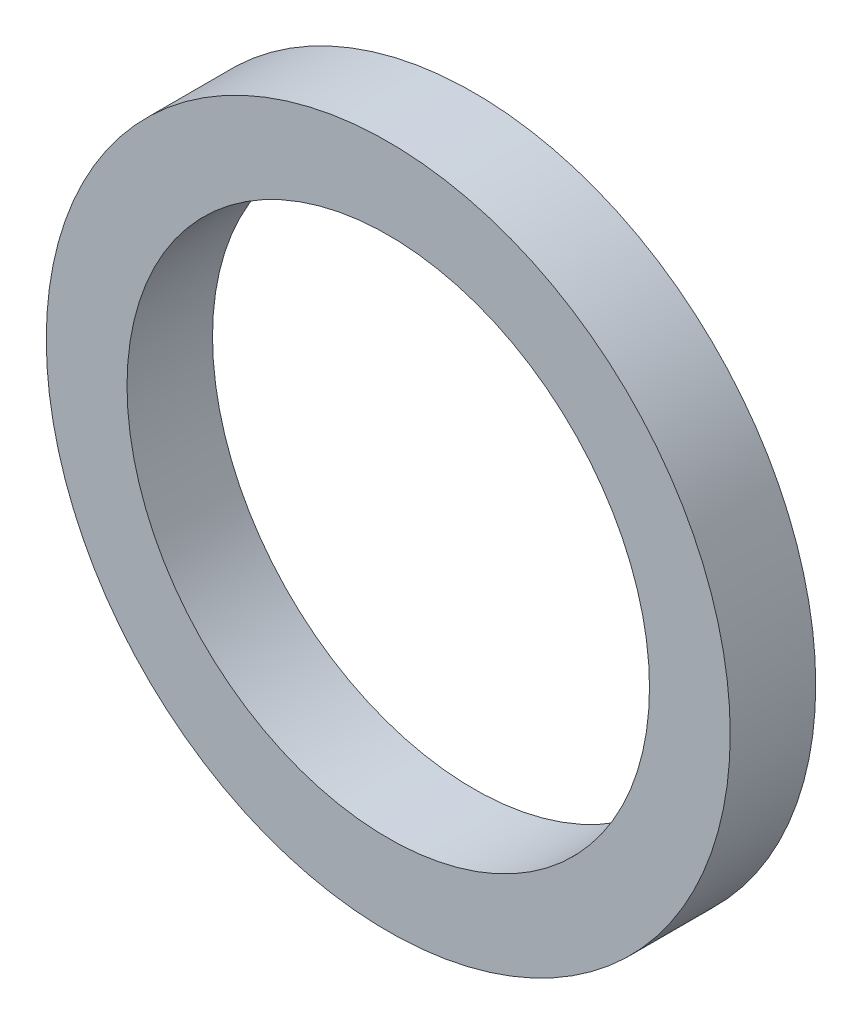
ISO-10303-21;
HEADER;
FILE_DESCRIPTION(('STEP AP214'),'2;1');
FILE_NAME('part.step','',(''),(''),'','','');
FILE_SCHEMA(('AUTOMOTIVE_DESIGN { 1 0 10303 214 1 1 1 1 }'));
ENDSEC;
DATA;
#1=APPLICATION_CONTEXT('core data for automotive mechanical design processes');
#2=APPLICATION_PROTOCOL_DEFINITION('international standard','automotive_design',2000,#1);
#3=PRODUCT_CONTEXT('',#1,'mechanical');
#4=PRODUCT('Part','Part','',(#3));
#5=PRODUCT_RELATED_PRODUCT_CATEGORY('part','',(#4));
#6=PRODUCT_DEFINITION_FORMATION('','',#4);
#7=PRODUCT_DEFINITION_CONTEXT('part definition',#1,'design');
#8=PRODUCT_DEFINITION('design','',#6,#7);
#9=PRODUCT_DEFINITION_SHAPE('','',#8);
#10=(LENGTH_UNIT() NAMED_UNIT(*) SI_UNIT(.MILLI.,.METRE.));
#11=(NAMED_UNIT(*) PLANE_ANGLE_UNIT() SI_UNIT($,.RADIAN.));
#12=(NAMED_UNIT(*) SI_UNIT($,.STERADIAN.) SOLID_ANGLE_UNIT());
#13=UNCERTAINTY_MEASURE_WITH_UNIT(LENGTH_MEASURE(1.E-05),#10,'distance_accuracy_value','');
#14=(GEOMETRIC_REPRESENTATION_CONTEXT(3) GLOBAL_UNCERTAINTY_ASSIGNED_CONTEXT((#13)) GLOBAL_UNIT_ASSIGNED_CONTEXT((#10,
#11,#12)) REPRESENTATION_CONTEXT('',''));
#15=CARTESIAN_POINT('',(0.,0.,0.));
#16=DIRECTION('',(0.,0.,1.));
#17=DIRECTION('',(1.,0.,0.));
#18=AXIS2_PLACEMENT_3D('',#15,#16,#17);
#19=CARTESIAN_POINT('',(0.,0.,9.));
#20=DIRECTION('',(0.,0.,1.));
#21=DIRECTION('',(1.,0.,0.));
#22=AXIS2_PLACEMENT_3D('',#19,#20,#21);
#23=PLANE('',#22);
#24=CARTESIAN_POINT('',(0.,0.,9.));
#25=DIRECTION('',(0.,0.,1.));
#26=DIRECTION('',(1.,0.,0.));
#27=AXIS2_PLACEMENT_3D('',#24,#25,#26);
#28=CIRCLE('',#27,36.);
#29=CARTESIAN_POINT('',(36.,0.,9.));
#30=VERTEX_POINT('',#29);
#31=EDGE_CURVE('E10',#30,#30,#28,.T.);
#32=ORIENTED_EDGE('',*,*,#31,.T.);
#33=EDGE_LOOP('',(#32));
#34=FACE_BOUND('',#33,.T.);
#35=CARTESIAN_POINT('',(0.,0.,9.));
#36=DIRECTION('',(0.,0.,1.));
#37=DIRECTION('',(1.,0.,0.));
#38=AXIS2_PLACEMENT_3D('',#35,#36,#37);
#39=CIRCLE('',#38,27.5);
#40=CARTESIAN_POINT('',(27.5,0.,9.));
#41=VERTEX_POINT('',#40);
#42=EDGE_CURVE('E43',#41,#41,#39,.T.);
#43=ORIENTED_EDGE('',*,*,#42,.F.);
#44=EDGE_LOOP('',(#43));
#45=FACE_BOUND('',#44,.T.);
#46=ADVANCED_FACE('F32',(#34,#45),#23,.T.);
#47=CARTESIAN_POINT('',(0.,0.,0.));
#48=DIRECTION('',(0.,0.,1.));
#49=DIRECTION('',(1.,0.,0.));
#50=AXIS2_PLACEMENT_3D('',#47,#48,#49);
#51=PLANE('',#50);
#52=CARTESIAN_POINT('',(0.,0.,0.));
#53=DIRECTION('',(0.,0.,1.));
#54=DIRECTION('',(1.,0.,0.));
#55=AXIS2_PLACEMENT_3D('',#52,#53,#54);
#56=CIRCLE('',#55,36.);
#57=CARTESIAN_POINT('',(36.,0.,0.));
#58=VERTEX_POINT('',#57);
#59=EDGE_CURVE('E36',#58,#58,#56,.T.);
#60=ORIENTED_EDGE('',*,*,#59,.F.);
#61=EDGE_LOOP('',(#60));
#62=FACE_BOUND('',#61,.T.);
#63=CARTESIAN_POINT('',(0.,0.,0.));
#64=DIRECTION('',(0.,0.,1.));
#65=DIRECTION('',(1.,0.,0.));
#66=AXIS2_PLACEMENT_3D('',#63,#64,#65);
#67=CIRCLE('',#66,27.5);
#68=CARTESIAN_POINT('',(27.5,0.,0.));
#69=VERTEX_POINT('',#68);
#70=EDGE_CURVE('E45',#69,#69,#67,.T.);
#71=ORIENTED_EDGE('',*,*,#70,.T.);
#72=EDGE_LOOP('',(#71));
#73=FACE_BOUND('',#72,.T.);
#74=ADVANCED_FACE('F55',(#62,#73),#51,.F.);
#75=CARTESIAN_POINT('',(0.,0.,9.));
#76=DIRECTION('',(0.,0.,-1.));
#77=DIRECTION('',(-1.,0.,0.));
#78=AXIS2_PLACEMENT_3D('',#75,#76,#77);
#79=CYLINDRICAL_SURFACE('',#78,36.);
#80=ORIENTED_EDGE('',*,*,#31,.F.);
#81=EDGE_LOOP('',(#80));
#82=FACE_BOUND('',#81,.T.);
#83=ORIENTED_EDGE('',*,*,#59,.T.);
#84=EDGE_LOOP('',(#83));
#85=FACE_BOUND('',#84,.T.);
#86=ADVANCED_FACE('F34',(#82,#85),#79,.T.);
#87=CARTESIAN_POINT('',(0.,0.,9.));
#88=DIRECTION('',(0.,0.,-1.));
#89=DIRECTION('',(-1.,0.,0.));
#90=AXIS2_PLACEMENT_3D('',#87,#88,#89);
#91=CYLINDRICAL_SURFACE('',#90,27.5);
#92=ORIENTED_EDGE('',*,*,#42,.T.);
#93=EDGE_LOOP('',(#92));
#94=FACE_BOUND('',#93,.T.);
#95=ORIENTED_EDGE('',*,*,#70,.F.);
#96=EDGE_LOOP('',(#95));
#97=FACE_BOUND('',#96,.T.);
#98=ADVANCED_FACE('F51',(#94,#97),#91,.F.);
#99=CLOSED_SHELL('',(#46,#74,#86,#98));
#100=MANIFOLD_SOLID_BREP('B2',#99);
#101=ADVANCED_BREP_SHAPE_REPRESENTATION('',(#18,#100),#14);
#102=SHAPE_DEFINITION_REPRESENTATION(#9,#101);
ENDSEC;
END-ISO-10303-21;
